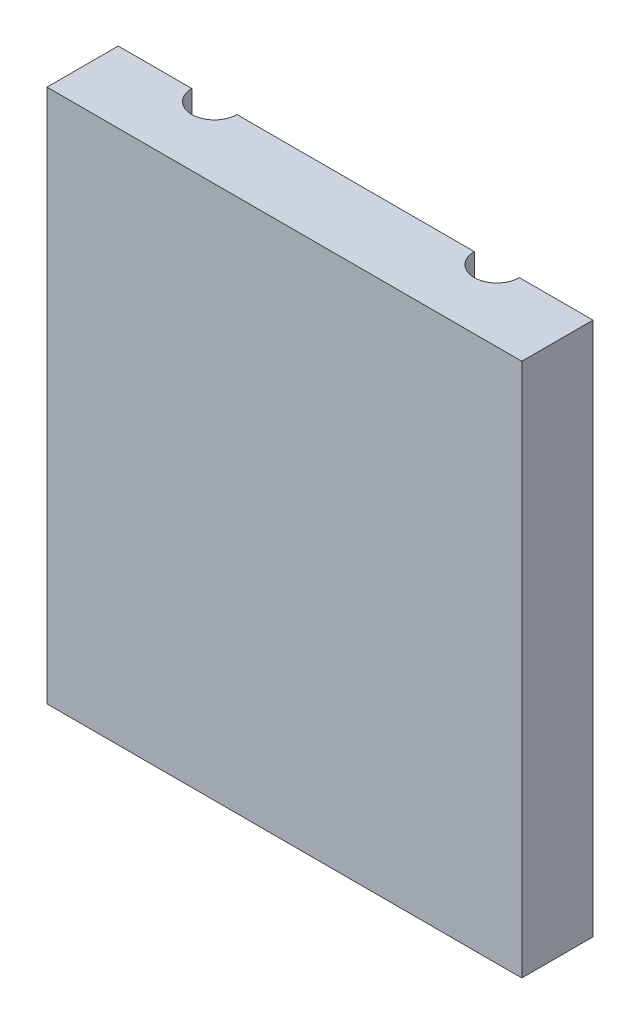
ISO-10303-21;
HEADER;
FILE_DESCRIPTION(('STEP AP214'),'2;1');
FILE_NAME('part.step','',(''),(''),'','','');
FILE_SCHEMA(('AUTOMOTIVE_DESIGN { 1 0 10303 214 1 1 1 1 }'));
ENDSEC;
DATA;
#1=APPLICATION_CONTEXT('core data for automotive mechanical design processes');
#2=APPLICATION_PROTOCOL_DEFINITION('international standard','automotive_design',2000,#1);
#3=PRODUCT_CONTEXT('',#1,'mechanical');
#4=PRODUCT('Part','Part','',(#3));
#5=PRODUCT_RELATED_PRODUCT_CATEGORY('part','',(#4));
#6=PRODUCT_DEFINITION_FORMATION('','',#4);
#7=PRODUCT_DEFINITION_CONTEXT('part definition',#1,'design');
#8=PRODUCT_DEFINITION('design','',#6,#7);
#9=PRODUCT_DEFINITION_SHAPE('','',#8);
#10=(LENGTH_UNIT() NAMED_UNIT(*) SI_UNIT(.MILLI.,.METRE.));
#11=(NAMED_UNIT(*) PLANE_ANGLE_UNIT() SI_UNIT($,.RADIAN.));
#12=(NAMED_UNIT(*) SI_UNIT($,.STERADIAN.) SOLID_ANGLE_UNIT());
#13=UNCERTAINTY_MEASURE_WITH_UNIT(LENGTH_MEASURE(1.E-05),#10,'distance_accuracy_value','');
#14=(GEOMETRIC_REPRESENTATION_CONTEXT(3) GLOBAL_UNCERTAINTY_ASSIGNED_CONTEXT((#13)) GLOBAL_UNIT_ASSIGNED_CONTEXT((#10,
#11,#12)) REPRESENTATION_CONTEXT('',''));
#15=CARTESIAN_POINT('',(0.,0.,0.));
#16=DIRECTION('',(0.,0.,1.));
#17=DIRECTION('',(1.,0.,0.));
#18=AXIS2_PLACEMENT_3D('',#15,#16,#17);
#19=CARTESIAN_POINT('',(0.,0.,0.));
#20=DIRECTION('',(0.,0.,1.));
#21=DIRECTION('',(1.,0.,0.));
#22=AXIS2_PLACEMENT_3D('',#19,#20,#21);
#23=PLANE('',#22);
#24=DIRECTION('',(1.,0.,0.));
#25=VECTOR('',#24,1.);
#26=CARTESIAN_POINT('',(-20.,-22.5,0.));
#27=LINE('',#26,#25);
#28=CARTESIAN_POINT('',(-10.,-22.5,0.));
#29=VERTEX_POINT('',#28);
#30=CARTESIAN_POINT('',(10.,-22.5,0.));
#31=VERTEX_POINT('',#30);
#32=EDGE_CURVE('E122',#29,#31,#27,.T.);
#33=ORIENTED_EDGE('',*,*,#32,.F.);
#34=DIRECTION('',(0.,1.,0.));
#35=VECTOR('',#34,1.);
#36=CARTESIAN_POINT('',(-10.,-22.5,0.));
#37=LINE('',#36,#35);
#38=CARTESIAN_POINT('',(-10.,22.5,0.));
#39=VERTEX_POINT('',#38);
#40=EDGE_CURVE('E107',#29,#39,#37,.T.);
#41=ORIENTED_EDGE('',*,*,#40,.T.);
#42=DIRECTION('',(-1.,0.,0.));
#43=VECTOR('',#42,1.);
#44=CARTESIAN_POINT('',(-20.,22.5,0.));
#45=LINE('',#44,#43);
#46=CARTESIAN_POINT('',(10.,22.5,0.));
#47=VERTEX_POINT('',#46);
#48=EDGE_CURVE('E164',#47,#39,#45,.T.);
#49=ORIENTED_EDGE('',*,*,#48,.F.);
#50=DIRECTION('',(0.,1.,0.));
#51=VECTOR('',#50,1.);
#52=CARTESIAN_POINT('',(10.,-22.5,0.));
#53=LINE('',#52,#51);
#54=EDGE_CURVE('E128',#31,#47,#53,.T.);
#55=ORIENTED_EDGE('',*,*,#54,.F.);
#56=EDGE_LOOP('',(#33,#41,#49,#55));
#57=FACE_BOUND('',#56,.T.);
#58=ADVANCED_FACE('F43',(#57),#23,.F.);
#59=CARTESIAN_POINT('',(13.8,-22.5,0.));
#60=VERTEX_POINT('',#59);
#61=CARTESIAN_POINT('',(20.,-22.5,0.));
#62=VERTEX_POINT('',#61);
#63=EDGE_CURVE('E130',#60,#62,#27,.T.);
#64=ORIENTED_EDGE('',*,*,#63,.F.);
#65=DIRECTION('',(0.,1.,0.));
#66=VECTOR('',#65,1.);
#67=CARTESIAN_POINT('',(13.8,-22.5,0.));
#68=LINE('',#67,#66);
#69=CARTESIAN_POINT('',(13.8,22.5,0.));
#70=VERTEX_POINT('',#69);
#71=EDGE_CURVE('E191',#60,#70,#68,.T.);
#72=ORIENTED_EDGE('',*,*,#71,.T.);
#73=CARTESIAN_POINT('',(20.,22.5,0.));
#74=VERTEX_POINT('',#73);
#75=EDGE_CURVE('E161',#74,#70,#45,.T.);
#76=ORIENTED_EDGE('',*,*,#75,.F.);
#77=DIRECTION('',(0.,1.,0.));
#78=VECTOR('',#77,1.);
#79=CARTESIAN_POINT('',(20.,22.5,0.));
#80=LINE('',#79,#78);
#81=EDGE_CURVE('E169',#62,#74,#80,.T.);
#82=ORIENTED_EDGE('',*,*,#81,.F.);
#83=EDGE_LOOP('',(#64,#72,#76,#82));
#84=FACE_BOUND('',#83,.T.);
#85=ADVANCED_FACE('F202',(#84),#23,.F.);
#86=CARTESIAN_POINT('',(20.,22.5,6.));
#87=DIRECTION('',(-1.,0.,0.));
#88=DIRECTION('',(0.,-1.,0.));
#89=AXIS2_PLACEMENT_3D('',#86,#87,#88);
#90=PLANE('',#89);
#91=ORIENTED_EDGE('',*,*,#81,.T.);
#92=DIRECTION('',(0.,0.,-1.));
#93=VECTOR('',#92,1.);
#94=CARTESIAN_POINT('',(20.,22.5,6.));
#95=LINE('',#94,#93);
#96=CARTESIAN_POINT('',(20.,22.5,6.));
#97=VERTEX_POINT('',#96);
#98=EDGE_CURVE('E11',#97,#74,#95,.T.);
#99=ORIENTED_EDGE('',*,*,#98,.F.);
#100=DIRECTION('',(0.,1.,0.));
#101=VECTOR('',#100,1.);
#102=CARTESIAN_POINT('',(20.,22.5,6.));
#103=LINE('',#102,#101);
#104=CARTESIAN_POINT('',(20.,-22.5,6.));
#105=VERTEX_POINT('',#104);
#106=EDGE_CURVE('E134',#105,#97,#103,.T.);
#107=ORIENTED_EDGE('',*,*,#106,.F.);
#108=DIRECTION('',(0.,0.,-1.));
#109=VECTOR('',#108,1.);
#110=CARTESIAN_POINT('',(20.,-22.5,6.));
#111=LINE('',#110,#109);
#112=EDGE_CURVE('E139',#105,#62,#111,.T.);
#113=ORIENTED_EDGE('',*,*,#112,.T.);
#114=EDGE_LOOP('',(#91,#99,#107,#113));
#115=FACE_BOUND('',#114,.T.);
#116=ADVANCED_FACE('F45',(#115),#90,.F.);
#117=CARTESIAN_POINT('',(-20.,22.5,6.));
#118=DIRECTION('',(0.,-1.,0.));
#119=DIRECTION('',(0.,0.,-1.));
#120=AXIS2_PLACEMENT_3D('',#117,#118,#119);
#121=PLANE('',#120);
#122=ORIENTED_EDGE('',*,*,#48,.T.);
#123=CARTESIAN_POINT('',(-11.9,22.5,0.));
#124=DIRECTION('',(0.,1.,0.));
#125=DIRECTION('',(0.,0.,1.));
#126=AXIS2_PLACEMENT_3D('',#123,#124,#125);
#127=CIRCLE('',#126,1.9);
#128=CARTESIAN_POINT('',(-13.8,22.5,0.));
#129=VERTEX_POINT('',#128);
#130=EDGE_CURVE('E110',#129,#39,#127,.T.);
#131=ORIENTED_EDGE('',*,*,#130,.F.);
#132=CARTESIAN_POINT('',(-20.,22.5,0.));
#133=VERTEX_POINT('',#132);
#134=EDGE_CURVE('E159',#129,#133,#45,.T.);
#135=ORIENTED_EDGE('',*,*,#134,.T.);
#136=DIRECTION('',(0.,0.,-1.));
#137=VECTOR('',#136,1.);
#138=CARTESIAN_POINT('',(-20.,22.5,6.));
#139=LINE('',#138,#137);
#140=CARTESIAN_POINT('',(-20.,22.5,6.));
#141=VERTEX_POINT('',#140);
#142=EDGE_CURVE('E52',#141,#133,#139,.T.);
#143=ORIENTED_EDGE('',*,*,#142,.F.);
#144=DIRECTION('',(-1.,0.,0.));
#145=VECTOR('',#144,1.);
#146=CARTESIAN_POINT('',(-20.,22.5,6.));
#147=LINE('',#146,#145);
#148=EDGE_CURVE('E182',#97,#141,#147,.T.);
#149=ORIENTED_EDGE('',*,*,#148,.F.);
#150=ORIENTED_EDGE('',*,*,#98,.T.);
#151=ORIENTED_EDGE('',*,*,#75,.T.);
#152=CARTESIAN_POINT('',(11.9,22.5,0.));
#153=DIRECTION('',(0.,1.,0.));
#154=DIRECTION('',(0.,0.,-1.));
#155=AXIS2_PLACEMENT_3D('',#152,#153,#154);
#156=CIRCLE('',#155,1.9);
#157=EDGE_CURVE('E190',#47,#70,#156,.T.);
#158=ORIENTED_EDGE('',*,*,#157,.F.);
#159=EDGE_LOOP('',(#122,#131,#135,#143,#149,#150,#151,#158));
#160=FACE_BOUND('',#159,.T.);
#161=ADVANCED_FACE('F209',(#160),#121,.F.);
#162=CARTESIAN_POINT('',(-20.,22.5,6.));
#163=DIRECTION('',(1.,0.,0.));
#164=DIRECTION('',(0.,1.,0.));
#165=AXIS2_PLACEMENT_3D('',#162,#163,#164);
#166=PLANE('',#165);
#167=DIRECTION('',(0.,-1.,0.));
#168=VECTOR('',#167,1.);
#169=CARTESIAN_POINT('',(-20.,22.5,0.));
#170=LINE('',#169,#168);
#171=CARTESIAN_POINT('',(-20.,-22.5,0.));
#172=VERTEX_POINT('',#171);
#173=EDGE_CURVE('E135',#133,#172,#170,.T.);
#174=ORIENTED_EDGE('',*,*,#173,.T.);
#175=DIRECTION('',(0.,0.,-1.));
#176=VECTOR('',#175,1.);
#177=CARTESIAN_POINT('',(-20.,-22.5,6.));
#178=LINE('',#177,#176);
#179=CARTESIAN_POINT('',(-20.,-22.5,6.));
#180=VERTEX_POINT('',#179);
#181=EDGE_CURVE('E143',#180,#172,#178,.T.);
#182=ORIENTED_EDGE('',*,*,#181,.F.);
#183=DIRECTION('',(0.,-1.,0.));
#184=VECTOR('',#183,1.);
#185=CARTESIAN_POINT('',(-20.,22.5,6.));
#186=LINE('',#185,#184);
#187=EDGE_CURVE('E154',#141,#180,#186,.T.);
#188=ORIENTED_EDGE('',*,*,#187,.F.);
#189=ORIENTED_EDGE('',*,*,#142,.T.);
#190=EDGE_LOOP('',(#174,#182,#188,#189));
#191=FACE_BOUND('',#190,.T.);
#192=ADVANCED_FACE('F152',(#191),#166,.F.);
#193=CARTESIAN_POINT('',(-20.,-22.5,6.));
#194=DIRECTION('',(0.,1.,0.));
#195=DIRECTION('',(0.,0.,1.));
#196=AXIS2_PLACEMENT_3D('',#193,#194,#195);
#197=PLANE('',#196);
#198=CARTESIAN_POINT('',(-13.8,-22.5,0.));
#199=VERTEX_POINT('',#198);
#200=EDGE_CURVE('E125',#172,#199,#27,.T.);
#201=ORIENTED_EDGE('',*,*,#200,.T.);
#202=CARTESIAN_POINT('',(-11.9,-22.5,0.));
#203=DIRECTION('',(0.,1.,0.));
#204=DIRECTION('',(0.,0.,1.));
#205=AXIS2_PLACEMENT_3D('',#202,#203,#204);
#206=CIRCLE('',#205,1.9);
#207=EDGE_CURVE('E67',#199,#29,#206,.T.);
#208=ORIENTED_EDGE('',*,*,#207,.T.);
#209=ORIENTED_EDGE('',*,*,#32,.T.);
#210=CARTESIAN_POINT('',(11.9,-22.5,0.));
#211=DIRECTION('',(0.,1.,0.));
#212=DIRECTION('',(0.,0.,-1.));
#213=AXIS2_PLACEMENT_3D('',#210,#211,#212);
#214=CIRCLE('',#213,1.9);
#215=EDGE_CURVE('E59',#31,#60,#214,.T.);
#216=ORIENTED_EDGE('',*,*,#215,.T.);
#217=ORIENTED_EDGE('',*,*,#63,.T.);
#218=ORIENTED_EDGE('',*,*,#112,.F.);
#219=DIRECTION('',(1.,0.,0.));
#220=VECTOR('',#219,1.);
#221=CARTESIAN_POINT('',(-20.,-22.5,6.));
#222=LINE('',#221,#220);
#223=EDGE_CURVE('E144',#180,#105,#222,.T.);
#224=ORIENTED_EDGE('',*,*,#223,.F.);
#225=ORIENTED_EDGE('',*,*,#181,.T.);
#226=EDGE_LOOP('',(#201,#208,#209,#216,#217,#218,#224,#225));
#227=FACE_BOUND('',#226,.T.);
#228=ADVANCED_FACE('F121',(#227),#197,.F.);
#229=CARTESIAN_POINT('',(0.,0.,6.));
#230=DIRECTION('',(0.,0.,1.));
#231=DIRECTION('',(1.,0.,0.));
#232=AXIS2_PLACEMENT_3D('',#229,#230,#231);
#233=PLANE('',#232);
#234=ORIENTED_EDGE('',*,*,#106,.T.);
#235=ORIENTED_EDGE('',*,*,#148,.T.);
#236=ORIENTED_EDGE('',*,*,#187,.T.);
#237=ORIENTED_EDGE('',*,*,#223,.T.);
#238=EDGE_LOOP('',(#234,#235,#236,#237));
#239=FACE_BOUND('',#238,.T.);
#240=ADVANCED_FACE('F208',(#239),#233,.T.);
#241=ORIENTED_EDGE('',*,*,#134,.F.);
#242=DIRECTION('',(0.,1.,0.));
#243=VECTOR('',#242,1.);
#244=CARTESIAN_POINT('',(-13.8,-22.5,0.));
#245=LINE('',#244,#243);
#246=EDGE_CURVE('E116',#199,#129,#245,.T.);
#247=ORIENTED_EDGE('',*,*,#246,.F.);
#248=ORIENTED_EDGE('',*,*,#200,.F.);
#249=ORIENTED_EDGE('',*,*,#173,.F.);
#250=EDGE_LOOP('',(#241,#247,#248,#249));
#251=FACE_BOUND('',#250,.T.);
#252=ADVANCED_FACE('F158',(#251),#23,.F.);
#253=CARTESIAN_POINT('',(11.9,-22.5,0.));
#254=DIRECTION('',(0.,1.,0.));
#255=DIRECTION('',(0.,0.,1.));
#256=AXIS2_PLACEMENT_3D('',#253,#254,#255);
#257=CYLINDRICAL_SURFACE('',#256,1.9);
#258=ORIENTED_EDGE('',*,*,#157,.T.);
#259=ORIENTED_EDGE('',*,*,#71,.F.);
#260=ORIENTED_EDGE('',*,*,#215,.F.);
#261=ORIENTED_EDGE('',*,*,#54,.T.);
#262=EDGE_LOOP('',(#258,#259,#260,#261));
#263=FACE_BOUND('',#262,.T.);
#264=ADVANCED_FACE('F203',(#263),#257,.F.);
#265=CARTESIAN_POINT('',(-11.9,-22.5,0.));
#266=DIRECTION('',(0.,1.,0.));
#267=DIRECTION('',(0.,0.,1.));
#268=AXIS2_PLACEMENT_3D('',#265,#266,#267);
#269=CYLINDRICAL_SURFACE('',#268,1.9);
#270=ORIENTED_EDGE('',*,*,#130,.T.);
#271=ORIENTED_EDGE('',*,*,#40,.F.);
#272=ORIENTED_EDGE('',*,*,#207,.F.);
#273=ORIENTED_EDGE('',*,*,#246,.T.);
#274=EDGE_LOOP('',(#270,#271,#272,#273));
#275=FACE_BOUND('',#274,.T.);
#276=ADVANCED_FACE('F108',(#275),#269,.F.);
#277=CLOSED_SHELL('',(#58,#85,#116,#161,#192,#228,#240,#252,#264,#276));
#278=MANIFOLD_SOLID_BREP('B2',#277);
#279=ADVANCED_BREP_SHAPE_REPRESENTATION('',(#18,#278),#14);
#280=SHAPE_DEFINITION_REPRESENTATION(#9,#279);
ENDSEC;
END-ISO-10303-21;
